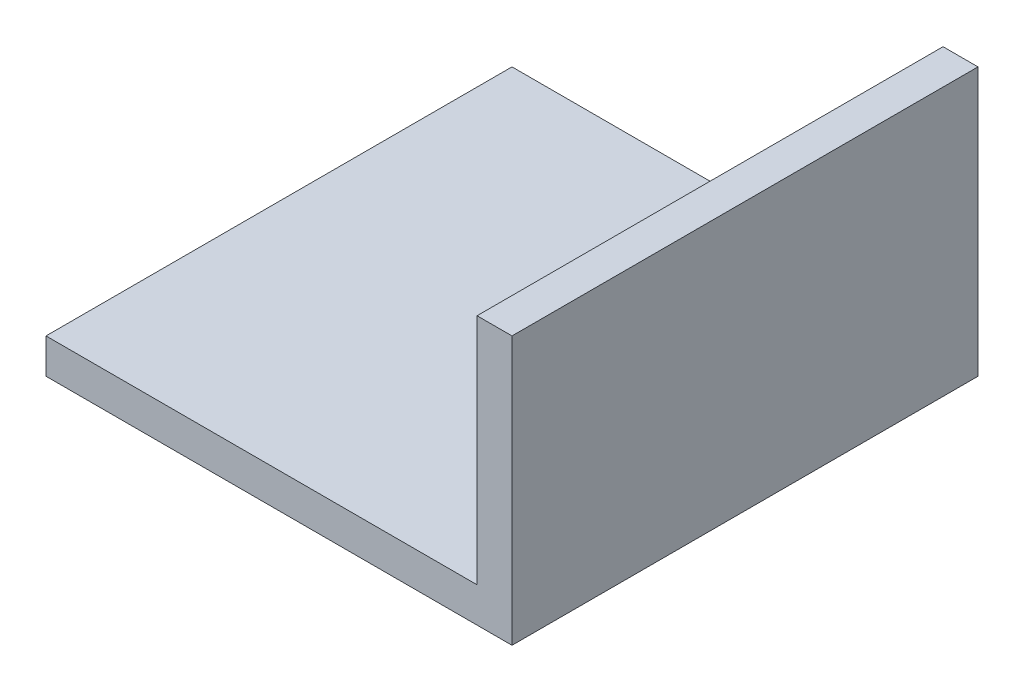
ISO-10303-21;
HEADER;
FILE_DESCRIPTION(('STEP AP214'),'2;1');
FILE_NAME('part.step','',(''),(''),'','','');
FILE_SCHEMA(('AUTOMOTIVE_DESIGN { 1 0 10303 214 1 1 1 1 }'));
ENDSEC;
DATA;
#1=APPLICATION_CONTEXT('core data for automotive mechanical design processes');
#2=APPLICATION_PROTOCOL_DEFINITION('international standard','automotive_design',2000,#1);
#3=PRODUCT_CONTEXT('',#1,'mechanical');
#4=PRODUCT('Part','Part','',(#3));
#5=PRODUCT_RELATED_PRODUCT_CATEGORY('part','',(#4));
#6=PRODUCT_DEFINITION_FORMATION('','',#4);
#7=PRODUCT_DEFINITION_CONTEXT('part definition',#1,'design');
#8=PRODUCT_DEFINITION('design','',#6,#7);
#9=PRODUCT_DEFINITION_SHAPE('','',#8);
#10=(LENGTH_UNIT() NAMED_UNIT(*) SI_UNIT(.MILLI.,.METRE.));
#11=(NAMED_UNIT(*) PLANE_ANGLE_UNIT() SI_UNIT($,.RADIAN.));
#12=(NAMED_UNIT(*) SI_UNIT($,.STERADIAN.) SOLID_ANGLE_UNIT());
#13=UNCERTAINTY_MEASURE_WITH_UNIT(LENGTH_MEASURE(1.E-05),#10,'distance_accuracy_value','');
#14=(GEOMETRIC_REPRESENTATION_CONTEXT(3) GLOBAL_UNCERTAINTY_ASSIGNED_CONTEXT((#13)) GLOBAL_UNIT_ASSIGNED_CONTEXT((#10,
#11,#12)) REPRESENTATION_CONTEXT('',''));
#15=CARTESIAN_POINT('',(0.,0.,0.));
#16=DIRECTION('',(0.,0.,1.));
#17=DIRECTION('',(1.,0.,0.));
#18=AXIS2_PLACEMENT_3D('',#15,#16,#17);
#19=CARTESIAN_POINT('',(0.,3.,0.));
#20=DIRECTION('',(0.,-1.,0.));
#21=DIRECTION('',(0.,0.,-1.));
#22=AXIS2_PLACEMENT_3D('',#19,#20,#21);
#23=PLANE('',#22);
#24=DIRECTION('',(0.,0.,1.));
#25=VECTOR('',#24,1.);
#26=CARTESIAN_POINT('',(37.,3.,0.));
#27=LINE('',#26,#25);
#28=CARTESIAN_POINT('',(37.,3.,-40.));
#29=VERTEX_POINT('',#28);
#30=CARTESIAN_POINT('',(37.,3.,0.));
#31=VERTEX_POINT('',#30);
#32=EDGE_CURVE('E50',#29,#31,#27,.T.);
#33=ORIENTED_EDGE('',*,*,#32,.F.);
#34=DIRECTION('',(-1.,0.,0.));
#35=VECTOR('',#34,1.);
#36=CARTESIAN_POINT('',(0.,3.,-40.));
#37=LINE('',#36,#35);
#38=CARTESIAN_POINT('',(0.,3.,-40.));
#39=VERTEX_POINT('',#38);
#40=EDGE_CURVE('E55',#29,#39,#37,.T.);
#41=ORIENTED_EDGE('',*,*,#40,.T.);
#42=DIRECTION('',(0.,0.,1.));
#43=VECTOR('',#42,1.);
#44=CARTESIAN_POINT('',(0.,3.,0.));
#45=LINE('',#44,#43);
#46=CARTESIAN_POINT('',(0.,3.,0.));
#47=VERTEX_POINT('',#46);
#48=EDGE_CURVE('E86',#39,#47,#45,.T.);
#49=ORIENTED_EDGE('',*,*,#48,.T.);
#50=DIRECTION('',(1.,0.,0.));
#51=VECTOR('',#50,1.);
#52=CARTESIAN_POINT('',(0.,3.,0.));
#53=LINE('',#52,#51);
#54=EDGE_CURVE('E109',#47,#31,#53,.T.);
#55=ORIENTED_EDGE('',*,*,#54,.T.);
#56=EDGE_LOOP('',(#33,#41,#49,#55));
#57=FACE_BOUND('',#56,.T.);
#58=ADVANCED_FACE('F33',(#57),#23,.F.);
#59=CARTESIAN_POINT('',(0.,3.,0.));
#60=DIRECTION('',(1.,0.,0.));
#61=DIRECTION('',(0.,0.,-1.));
#62=AXIS2_PLACEMENT_3D('',#59,#60,#61);
#63=PLANE('',#62);
#64=DIRECTION('',(0.,0.,1.));
#65=VECTOR('',#64,1.);
#66=CARTESIAN_POINT('',(0.,0.,0.));
#67=LINE('',#66,#65);
#68=CARTESIAN_POINT('',(0.,0.,-40.));
#69=VERTEX_POINT('',#68);
#70=CARTESIAN_POINT('',(0.,0.,0.));
#71=VERTEX_POINT('',#70);
#72=EDGE_CURVE('E92',#69,#71,#67,.T.);
#73=ORIENTED_EDGE('',*,*,#72,.T.);
#74=DIRECTION('',(0.,-1.,0.));
#75=VECTOR('',#74,1.);
#76=CARTESIAN_POINT('',(0.,3.,0.));
#77=LINE('',#76,#75);
#78=EDGE_CURVE('E11',#47,#71,#77,.T.);
#79=ORIENTED_EDGE('',*,*,#78,.F.);
#80=ORIENTED_EDGE('',*,*,#48,.F.);
#81=DIRECTION('',(0.,-1.,0.));
#82=VECTOR('',#81,1.);
#83=CARTESIAN_POINT('',(0.,3.,-40.));
#84=LINE('',#83,#82);
#85=EDGE_CURVE('E78',#39,#69,#84,.T.);
#86=ORIENTED_EDGE('',*,*,#85,.T.);
#87=EDGE_LOOP('',(#73,#79,#80,#86));
#88=FACE_BOUND('',#87,.T.);
#89=ADVANCED_FACE('F35',(#88),#63,.F.);
#90=CARTESIAN_POINT('',(0.,3.,0.));
#91=DIRECTION('',(0.,0.,-1.));
#92=DIRECTION('',(-1.,0.,0.));
#93=AXIS2_PLACEMENT_3D('',#90,#91,#92);
#94=PLANE('',#93);
#95=DIRECTION('',(1.,0.,0.));
#96=VECTOR('',#95,1.);
#97=CARTESIAN_POINT('',(0.,0.,0.));
#98=LINE('',#97,#96);
#99=CARTESIAN_POINT('',(40.,0.,0.));
#100=VERTEX_POINT('',#99);
#101=EDGE_CURVE('E95',#71,#100,#98,.T.);
#102=ORIENTED_EDGE('',*,*,#101,.T.);
#103=DIRECTION('',(0.,-1.,0.));
#104=VECTOR('',#103,1.);
#105=CARTESIAN_POINT('',(40.,3.,0.));
#106=LINE('',#105,#104);
#107=CARTESIAN_POINT('',(40.,23.,0.));
#108=VERTEX_POINT('',#107);
#109=EDGE_CURVE('E42',#108,#100,#106,.T.);
#110=ORIENTED_EDGE('',*,*,#109,.F.);
#111=DIRECTION('',(1.,0.,0.));
#112=VECTOR('',#111,1.);
#113=CARTESIAN_POINT('',(40.,23.,0.));
#114=LINE('',#113,#112);
#115=CARTESIAN_POINT('',(37.,23.,0.));
#116=VERTEX_POINT('',#115);
#117=EDGE_CURVE('E117',#116,#108,#114,.T.);
#118=ORIENTED_EDGE('',*,*,#117,.F.);
#119=DIRECTION('',(0.,-1.,0.));
#120=VECTOR('',#119,1.);
#121=CARTESIAN_POINT('',(37.,23.,0.));
#122=LINE('',#121,#120);
#123=EDGE_CURVE('E100',#116,#31,#122,.T.);
#124=ORIENTED_EDGE('',*,*,#123,.T.);
#125=ORIENTED_EDGE('',*,*,#54,.F.);
#126=ORIENTED_EDGE('',*,*,#78,.T.);
#127=EDGE_LOOP('',(#102,#110,#118,#124,#125,#126));
#128=FACE_BOUND('',#127,.T.);
#129=ADVANCED_FACE('F153',(#128),#94,.F.);
#130=CARTESIAN_POINT('',(40.,3.,0.));
#131=DIRECTION('',(-1.,0.,0.));
#132=DIRECTION('',(0.,0.,1.));
#133=AXIS2_PLACEMENT_3D('',#130,#131,#132);
#134=PLANE('',#133);
#135=DIRECTION('',(0.,0.,-1.));
#136=VECTOR('',#135,1.);
#137=CARTESIAN_POINT('',(40.,0.,0.));
#138=LINE('',#137,#136);
#139=CARTESIAN_POINT('',(40.,0.,-40.));
#140=VERTEX_POINT('',#139);
#141=EDGE_CURVE('E87',#100,#140,#138,.T.);
#142=ORIENTED_EDGE('',*,*,#141,.T.);
#143=DIRECTION('',(0.,-1.,0.));
#144=VECTOR('',#143,1.);
#145=CARTESIAN_POINT('',(40.,3.,-40.));
#146=LINE('',#145,#144);
#147=CARTESIAN_POINT('',(40.,23.,-40.));
#148=VERTEX_POINT('',#147);
#149=EDGE_CURVE('E82',#148,#140,#146,.T.);
#150=ORIENTED_EDGE('',*,*,#149,.F.);
#151=DIRECTION('',(0.,0.,-1.));
#152=VECTOR('',#151,1.);
#153=CARTESIAN_POINT('',(40.,23.,0.));
#154=LINE('',#153,#152);
#155=EDGE_CURVE('E120',#108,#148,#154,.T.);
#156=ORIENTED_EDGE('',*,*,#155,.F.);
#157=ORIENTED_EDGE('',*,*,#109,.T.);
#158=EDGE_LOOP('',(#142,#150,#156,#157));
#159=FACE_BOUND('',#158,.T.);
#160=ADVANCED_FACE('F146',(#159),#134,.F.);
#161=CARTESIAN_POINT('',(0.,3.,-40.));
#162=DIRECTION('',(0.,0.,1.));
#163=DIRECTION('',(1.,0.,0.));
#164=AXIS2_PLACEMENT_3D('',#161,#162,#163);
#165=PLANE('',#164);
#166=DIRECTION('',(-1.,0.,0.));
#167=VECTOR('',#166,1.);
#168=CARTESIAN_POINT('',(0.,0.,-40.));
#169=LINE('',#168,#167);
#170=EDGE_CURVE('E75',#140,#69,#169,.T.);
#171=ORIENTED_EDGE('',*,*,#170,.T.);
#172=ORIENTED_EDGE('',*,*,#85,.F.);
#173=ORIENTED_EDGE('',*,*,#40,.F.);
#174=DIRECTION('',(0.,-1.,0.));
#175=VECTOR('',#174,1.);
#176=CARTESIAN_POINT('',(37.,23.,-40.));
#177=LINE('',#176,#175);
#178=CARTESIAN_POINT('',(37.,23.,-40.));
#179=VERTEX_POINT('',#178);
#180=EDGE_CURVE('E96',#179,#29,#177,.T.);
#181=ORIENTED_EDGE('',*,*,#180,.F.);
#182=DIRECTION('',(-1.,0.,0.));
#183=VECTOR('',#182,1.);
#184=CARTESIAN_POINT('',(40.,23.,-40.));
#185=LINE('',#184,#183);
#186=EDGE_CURVE('E134',#148,#179,#185,.T.);
#187=ORIENTED_EDGE('',*,*,#186,.F.);
#188=ORIENTED_EDGE('',*,*,#149,.T.);
#189=EDGE_LOOP('',(#171,#172,#173,#181,#187,#188));
#190=FACE_BOUND('',#189,.T.);
#191=ADVANCED_FACE('F77',(#190),#165,.F.);
#192=CARTESIAN_POINT('',(0.,0.,0.));
#193=DIRECTION('',(0.,-1.,0.));
#194=DIRECTION('',(0.,0.,-1.));
#195=AXIS2_PLACEMENT_3D('',#192,#193,#194);
#196=PLANE('',#195);
#197=ORIENTED_EDGE('',*,*,#72,.F.);
#198=ORIENTED_EDGE('',*,*,#170,.F.);
#199=ORIENTED_EDGE('',*,*,#141,.F.);
#200=ORIENTED_EDGE('',*,*,#101,.F.);
#201=EDGE_LOOP('',(#197,#198,#199,#200));
#202=FACE_BOUND('',#201,.T.);
#203=ADVANCED_FACE('F94',(#202),#196,.T.);
#204=CARTESIAN_POINT('',(37.,23.,0.));
#205=DIRECTION('',(1.,0.,0.));
#206=DIRECTION('',(0.,0.,-1.));
#207=AXIS2_PLACEMENT_3D('',#204,#205,#206);
#208=PLANE('',#207);
#209=ORIENTED_EDGE('',*,*,#32,.T.);
#210=ORIENTED_EDGE('',*,*,#123,.F.);
#211=DIRECTION('',(0.,0.,1.));
#212=VECTOR('',#211,1.);
#213=CARTESIAN_POINT('',(37.,23.,0.));
#214=LINE('',#213,#212);
#215=EDGE_CURVE('E129',#179,#116,#214,.T.);
#216=ORIENTED_EDGE('',*,*,#215,.F.);
#217=ORIENTED_EDGE('',*,*,#180,.T.);
#218=EDGE_LOOP('',(#209,#210,#216,#217));
#219=FACE_BOUND('',#218,.T.);
#220=ADVANCED_FACE('F152',(#219),#208,.F.);
#221=CARTESIAN_POINT('',(0.,23.,0.));
#222=DIRECTION('',(0.,1.,0.));
#223=DIRECTION('',(0.,0.,1.));
#224=AXIS2_PLACEMENT_3D('',#221,#222,#223);
#225=PLANE('',#224);
#226=ORIENTED_EDGE('',*,*,#155,.T.);
#227=ORIENTED_EDGE('',*,*,#186,.T.);
#228=ORIENTED_EDGE('',*,*,#215,.T.);
#229=ORIENTED_EDGE('',*,*,#117,.T.);
#230=EDGE_LOOP('',(#226,#227,#228,#229));
#231=FACE_BOUND('',#230,.T.);
#232=ADVANCED_FACE('F141',(#231),#225,.T.);
#233=CLOSED_SHELL('',(#58,#89,#129,#160,#191,#203,#220,#232));
#234=MANIFOLD_SOLID_BREP('B2',#233);
#235=ADVANCED_BREP_SHAPE_REPRESENTATION('',(#18,#234),#14);
#236=SHAPE_DEFINITION_REPRESENTATION(#9,#235);
ENDSEC;
END-ISO-10303-21;
